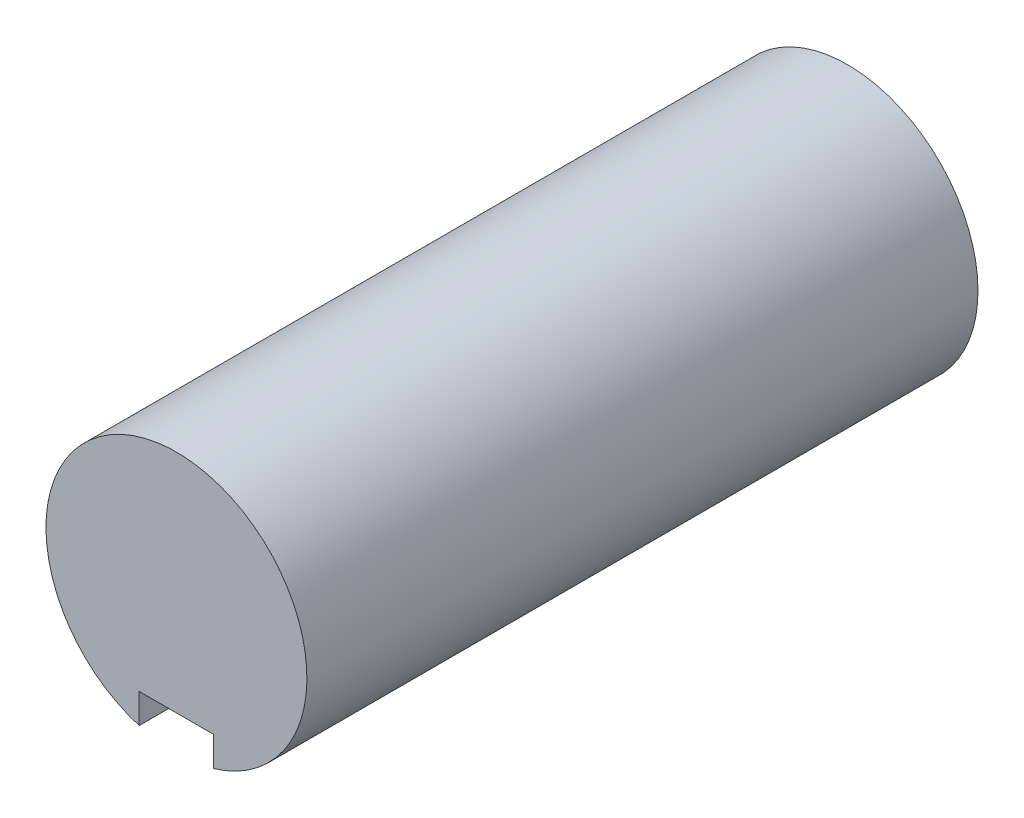
ISO-10303-21;
HEADER;
FILE_DESCRIPTION(('STEP AP214'),'2;1');
FILE_NAME('part.step','',(''),(''),'','','');
FILE_SCHEMA(('AUTOMOTIVE_DESIGN { 1 0 10303 214 1 1 1 1 }'));
ENDSEC;
DATA;
#1=APPLICATION_CONTEXT('core data for automotive mechanical design processes');
#2=APPLICATION_PROTOCOL_DEFINITION('international standard','automotive_design',2000,#1);
#3=PRODUCT_CONTEXT('',#1,'mechanical');
#4=PRODUCT('Part','Part','',(#3));
#5=PRODUCT_RELATED_PRODUCT_CATEGORY('part','',(#4));
#6=PRODUCT_DEFINITION_FORMATION('','',#4);
#7=PRODUCT_DEFINITION_CONTEXT('part definition',#1,'design');
#8=PRODUCT_DEFINITION('design','',#6,#7);
#9=PRODUCT_DEFINITION_SHAPE('','',#8);
#10=(LENGTH_UNIT() NAMED_UNIT(*) SI_UNIT(.MILLI.,.METRE.));
#11=(NAMED_UNIT(*) PLANE_ANGLE_UNIT() SI_UNIT($,.RADIAN.));
#12=(NAMED_UNIT(*) SI_UNIT($,.STERADIAN.) SOLID_ANGLE_UNIT());
#13=UNCERTAINTY_MEASURE_WITH_UNIT(LENGTH_MEASURE(1.E-05),#10,'distance_accuracy_value','');
#14=(GEOMETRIC_REPRESENTATION_CONTEXT(3) GLOBAL_UNCERTAINTY_ASSIGNED_CONTEXT((#13)) GLOBAL_UNIT_ASSIGNED_CONTEXT((#10,
#11,#12)) REPRESENTATION_CONTEXT('',''));
#15=CARTESIAN_POINT('',(0.,0.,0.));
#16=DIRECTION('',(0.,0.,1.));
#17=DIRECTION('',(1.,0.,0.));
#18=AXIS2_PLACEMENT_3D('',#15,#16,#17);
#19=CARTESIAN_POINT('',(5.,-16.7705098312484,90.));
#20=DIRECTION('',(1.,0.,0.));
#21=DIRECTION('',(0.,1.,0.));
#22=AXIS2_PLACEMENT_3D('',#19,#20,#21);
#23=PLANE('',#22);
#24=DIRECTION('',(0.,1.,0.));
#25=VECTOR('',#24,1.);
#26=CARTESIAN_POINT('',(5.00000000000001,0.,38.));
#27=LINE('',#26,#25);
#28=CARTESIAN_POINT('',(5.,-16.7705098312484,38.));
#29=VERTEX_POINT('',#28);
#30=CARTESIAN_POINT('',(5.,-12.8,38.));
#31=VERTEX_POINT('',#30);
#32=EDGE_CURVE('E50',#29,#31,#27,.T.);
#33=ORIENTED_EDGE('',*,*,#32,.F.);
#34=DIRECTION('',(0.,0.,-1.));
#35=VECTOR('',#34,1.);
#36=CARTESIAN_POINT('',(5.,-16.7705098312484,90.));
#37=LINE('',#36,#35);
#38=CARTESIAN_POINT('',(5.,-16.7705098312484,90.));
#39=VERTEX_POINT('',#38);
#40=EDGE_CURVE('E11',#39,#29,#37,.T.);
#41=ORIENTED_EDGE('',*,*,#40,.F.);
#42=DIRECTION('',(0.,-1.,0.));
#43=VECTOR('',#42,1.);
#44=CARTESIAN_POINT('',(5.,-16.7705098312484,90.));
#45=LINE('',#44,#43);
#46=CARTESIAN_POINT('',(5.,-12.8,90.));
#47=VERTEX_POINT('',#46);
#48=EDGE_CURVE('E82',#47,#39,#45,.T.);
#49=ORIENTED_EDGE('',*,*,#48,.F.);
#50=DIRECTION('',(0.,0.,-1.));
#51=VECTOR('',#50,1.);
#52=CARTESIAN_POINT('',(5.,-12.8,90.));
#53=LINE('',#52,#51);
#54=EDGE_CURVE('E122',#47,#31,#53,.T.);
#55=ORIENTED_EDGE('',*,*,#54,.T.);
#56=EDGE_LOOP('',(#33,#41,#49,#55));
#57=FACE_BOUND('',#56,.T.);
#58=ADVANCED_FACE('F36',(#57),#23,.F.);
#59=CARTESIAN_POINT('',(-5.,-16.7705098312484,90.));
#60=DIRECTION('',(-1.,0.,0.));
#61=DIRECTION('',(0.,-1.,0.));
#62=AXIS2_PLACEMENT_3D('',#59,#60,#61);
#63=PLANE('',#62);
#64=DIRECTION('',(0.,-1.,0.));
#65=VECTOR('',#64,1.);
#66=CARTESIAN_POINT('',(-5.,0.,38.));
#67=LINE('',#66,#65);
#68=CARTESIAN_POINT('',(-5.,-12.8,38.));
#69=VERTEX_POINT('',#68);
#70=CARTESIAN_POINT('',(-5.,-16.7705098312484,38.));
#71=VERTEX_POINT('',#70);
#72=EDGE_CURVE('E117',#69,#71,#67,.T.);
#73=ORIENTED_EDGE('',*,*,#72,.F.);
#74=DIRECTION('',(0.,0.,-1.));
#75=VECTOR('',#74,1.);
#76=CARTESIAN_POINT('',(-5.,-12.8,90.));
#77=LINE('',#76,#75);
#78=CARTESIAN_POINT('',(-5.,-12.8,90.));
#79=VERTEX_POINT('',#78);
#80=EDGE_CURVE('E124',#79,#69,#77,.T.);
#81=ORIENTED_EDGE('',*,*,#80,.F.);
#82=DIRECTION('',(0.,1.,0.));
#83=VECTOR('',#82,1.);
#84=CARTESIAN_POINT('',(-5.,-16.7705098312484,90.));
#85=LINE('',#84,#83);
#86=CARTESIAN_POINT('',(-5.,-16.7705098312484,90.));
#87=VERTEX_POINT('',#86);
#88=EDGE_CURVE('E81',#87,#79,#85,.T.);
#89=ORIENTED_EDGE('',*,*,#88,.F.);
#90=DIRECTION('',(0.,0.,-1.));
#91=VECTOR('',#90,1.);
#92=CARTESIAN_POINT('',(-5.,-16.7705098312484,90.));
#93=LINE('',#92,#91);
#94=EDGE_CURVE('E43',#87,#71,#93,.T.);
#95=ORIENTED_EDGE('',*,*,#94,.T.);
#96=EDGE_LOOP('',(#73,#81,#89,#95));
#97=FACE_BOUND('',#96,.T.);
#98=ADVANCED_FACE('F92',(#97),#63,.F.);
#99=CARTESIAN_POINT('',(-5.,-12.8,90.));
#100=DIRECTION('',(0.,1.,0.));
#101=DIRECTION('',(0.,0.,1.));
#102=AXIS2_PLACEMENT_3D('',#99,#100,#101);
#103=PLANE('',#102);
#104=DIRECTION('',(-1.,0.,0.));
#105=VECTOR('',#104,1.);
#106=CARTESIAN_POINT('',(0.,-12.8,38.));
#107=LINE('',#106,#105);
#108=EDGE_CURVE('E114',#31,#69,#107,.T.);
#109=ORIENTED_EDGE('',*,*,#108,.F.);
#110=ORIENTED_EDGE('',*,*,#54,.F.);
#111=DIRECTION('',(1.,0.,0.));
#112=VECTOR('',#111,1.);
#113=CARTESIAN_POINT('',(-5.,-12.8,90.));
#114=LINE('',#113,#112);
#115=EDGE_CURVE('E87',#79,#47,#114,.T.);
#116=ORIENTED_EDGE('',*,*,#115,.F.);
#117=ORIENTED_EDGE('',*,*,#80,.T.);
#118=EDGE_LOOP('',(#109,#110,#116,#117));
#119=FACE_BOUND('',#118,.T.);
#120=ADVANCED_FACE('F96',(#119),#103,.F.);
#121=CARTESIAN_POINT('',(0.,0.,90.));
#122=DIRECTION('',(0.,0.,-1.));
#123=DIRECTION('',(-1.,0.,0.));
#124=AXIS2_PLACEMENT_3D('',#121,#122,#123);
#125=CYLINDRICAL_SURFACE('',#124,17.5);
#126=CARTESIAN_POINT('',(0.,0.,0.));
#127=DIRECTION('',(0.,0.,1.));
#128=DIRECTION('',(1.,0.,0.));
#129=AXIS2_PLACEMENT_3D('',#126,#127,#128);
#130=CIRCLE('',#129,17.5);
#131=CARTESIAN_POINT('',(17.5,0.,0.));
#132=VERTEX_POINT('',#131);
#133=EDGE_CURVE('E89',#132,#132,#130,.T.);
#134=ORIENTED_EDGE('',*,*,#133,.T.);
#135=EDGE_LOOP('',(#134));
#136=FACE_BOUND('',#135,.T.);
#137=ORIENTED_EDGE('',*,*,#40,.T.);
#138=CARTESIAN_POINT('',(0.,0.,38.));
#139=DIRECTION('',(0.,0.,-1.));
#140=DIRECTION('',(-1.,0.,0.));
#141=AXIS2_PLACEMENT_3D('',#138,#139,#140);
#142=CIRCLE('',#141,17.5);
#143=EDGE_CURVE('E129',#29,#71,#142,.T.);
#144=ORIENTED_EDGE('',*,*,#143,.T.);
#145=ORIENTED_EDGE('',*,*,#94,.F.);
#146=CARTESIAN_POINT('',(0.,0.,90.));
#147=DIRECTION('',(0.,0.,1.));
#148=DIRECTION('',(1.,0.,0.));
#149=AXIS2_PLACEMENT_3D('',#146,#147,#148);
#150=CIRCLE('',#149,17.5);
#151=EDGE_CURVE('E75',#39,#87,#150,.T.);
#152=ORIENTED_EDGE('',*,*,#151,.F.);
#153=EDGE_LOOP('',(#137,#144,#145,#152));
#154=FACE_BOUND('',#153,.T.);
#155=ADVANCED_FACE('F77',(#136,#154),#125,.T.);
#156=CARTESIAN_POINT('',(0.,0.,90.));
#157=DIRECTION('',(0.,0.,1.));
#158=DIRECTION('',(1.,0.,0.));
#159=AXIS2_PLACEMENT_3D('',#156,#157,#158);
#160=PLANE('',#159);
#161=ORIENTED_EDGE('',*,*,#48,.T.);
#162=ORIENTED_EDGE('',*,*,#151,.T.);
#163=ORIENTED_EDGE('',*,*,#88,.T.);
#164=ORIENTED_EDGE('',*,*,#115,.T.);
#165=EDGE_LOOP('',(#161,#162,#163,#164));
#166=FACE_BOUND('',#165,.T.);
#167=ADVANCED_FACE('F85',(#166),#160,.T.);
#168=CARTESIAN_POINT('',(0.,0.,0.));
#169=DIRECTION('',(0.,0.,1.));
#170=DIRECTION('',(1.,0.,0.));
#171=AXIS2_PLACEMENT_3D('',#168,#169,#170);
#172=PLANE('',#171);
#173=ORIENTED_EDGE('',*,*,#133,.F.);
#174=EDGE_LOOP('',(#173));
#175=FACE_BOUND('',#174,.T.);
#176=ADVANCED_FACE('F109',(#175),#172,.F.);
#177=CARTESIAN_POINT('',(0.,0.,38.));
#178=DIRECTION('',(0.,0.,-1.));
#179=DIRECTION('',(-1.,0.,0.));
#180=AXIS2_PLACEMENT_3D('',#177,#178,#179);
#181=PLANE('',#180);
#182=ORIENTED_EDGE('',*,*,#32,.T.);
#183=ORIENTED_EDGE('',*,*,#108,.T.);
#184=ORIENTED_EDGE('',*,*,#72,.T.);
#185=ORIENTED_EDGE('',*,*,#143,.F.);
#186=EDGE_LOOP('',(#182,#183,#184,#185));
#187=FACE_BOUND('',#186,.T.);
#188=ADVANCED_FACE('F128',(#187),#181,.F.);
#189=CLOSED_SHELL('',(#58,#98,#120,#155,#167,#176,#188));
#190=MANIFOLD_SOLID_BREP('B2',#189);
#191=ADVANCED_BREP_SHAPE_REPRESENTATION('',(#18,#190),#14);
#192=SHAPE_DEFINITION_REPRESENTATION(#9,#191);
ENDSEC;
END-ISO-10303-21;
